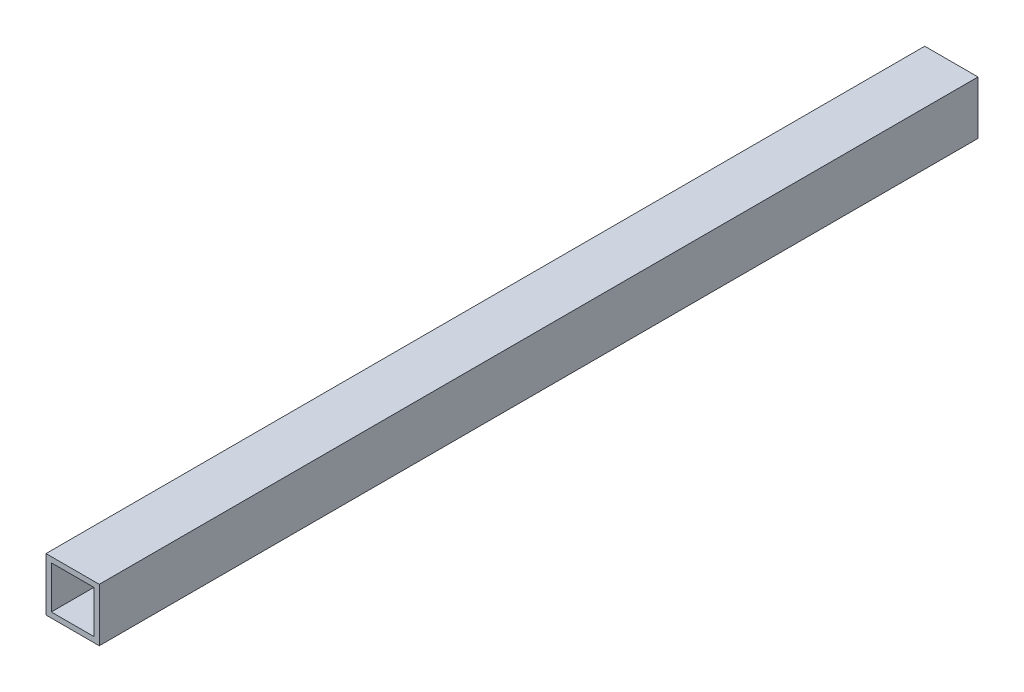
ISO-10303-21;
HEADER;
FILE_DESCRIPTION(('STEP AP214'),'2;1');
FILE_NAME('part.step','',(''),(''),'','','');
FILE_SCHEMA(('AUTOMOTIVE_DESIGN { 1 0 10303 214 1 1 1 1 }'));
ENDSEC;
DATA;
#1=APPLICATION_CONTEXT('core data for automotive mechanical design processes');
#2=APPLICATION_PROTOCOL_DEFINITION('international standard','automotive_design',2000,#1);
#3=PRODUCT_CONTEXT('',#1,'mechanical');
#4=PRODUCT('Part','Part','',(#3));
#5=PRODUCT_RELATED_PRODUCT_CATEGORY('part','',(#4));
#6=PRODUCT_DEFINITION_FORMATION('','',#4);
#7=PRODUCT_DEFINITION_CONTEXT('part definition',#1,'design');
#8=PRODUCT_DEFINITION('design','',#6,#7);
#9=PRODUCT_DEFINITION_SHAPE('','',#8);
#10=(LENGTH_UNIT() NAMED_UNIT(*) SI_UNIT(.MILLI.,.METRE.));
#11=(NAMED_UNIT(*) PLANE_ANGLE_UNIT() SI_UNIT($,.RADIAN.));
#12=(NAMED_UNIT(*) SI_UNIT($,.STERADIAN.) SOLID_ANGLE_UNIT());
#13=UNCERTAINTY_MEASURE_WITH_UNIT(LENGTH_MEASURE(1.E-05),#10,'distance_accuracy_value','');
#14=(GEOMETRIC_REPRESENTATION_CONTEXT(3) GLOBAL_UNCERTAINTY_ASSIGNED_CONTEXT((#13)) GLOBAL_UNIT_ASSIGNED_CONTEXT((#10,
#11,#12)) REPRESENTATION_CONTEXT('',''));
#15=CARTESIAN_POINT('',(0.,0.,0.));
#16=DIRECTION('',(0.,0.,1.));
#17=DIRECTION('',(1.,0.,0.));
#18=AXIS2_PLACEMENT_3D('',#15,#16,#17);
#19=CARTESIAN_POINT('',(0.,0.,209.55));
#20=DIRECTION('',(0.,0.,-1.));
#21=DIRECTION('',(-1.,0.,0.));
#22=AXIS2_PLACEMENT_3D('',#19,#20,#21);
#23=PLANE('',#22);
#24=DIRECTION('',(0.,1.,0.));
#25=VECTOR('',#24,1.);
#26=CARTESIAN_POINT('',(12.7,-12.7,209.55));
#27=LINE('',#26,#25);
#28=CARTESIAN_POINT('',(12.7,-12.7,209.55));
#29=VERTEX_POINT('',#28);
#30=CARTESIAN_POINT('',(12.7,12.7,209.55));
#31=VERTEX_POINT('',#30);
#32=EDGE_CURVE('E135',#29,#31,#27,.T.);
#33=ORIENTED_EDGE('',*,*,#32,.T.);
#34=DIRECTION('',(-1.,0.,0.));
#35=VECTOR('',#34,1.);
#36=CARTESIAN_POINT('',(-12.7,12.7,209.55));
#37=LINE('',#36,#35);
#38=CARTESIAN_POINT('',(-12.7,12.7,209.55));
#39=VERTEX_POINT('',#38);
#40=EDGE_CURVE('E138',#31,#39,#37,.T.);
#41=ORIENTED_EDGE('',*,*,#40,.T.);
#42=DIRECTION('',(0.,-1.,0.));
#43=VECTOR('',#42,1.);
#44=CARTESIAN_POINT('',(-12.7,-12.7,209.55));
#45=LINE('',#44,#43);
#46=CARTESIAN_POINT('',(-12.7,-12.7,209.55));
#47=VERTEX_POINT('',#46);
#48=EDGE_CURVE('E141',#39,#47,#45,.T.);
#49=ORIENTED_EDGE('',*,*,#48,.T.);
#50=DIRECTION('',(1.,0.,0.));
#51=VECTOR('',#50,1.);
#52=CARTESIAN_POINT('',(-12.7,-12.7,209.55));
#53=LINE('',#52,#51);
#54=EDGE_CURVE('E143',#47,#29,#53,.T.);
#55=ORIENTED_EDGE('',*,*,#54,.T.);
#56=EDGE_LOOP('',(#33,#41,#49,#55));
#57=FACE_BOUND('',#56,.T.);
#58=DIRECTION('',(0.,-1.,0.));
#59=VECTOR('',#58,1.);
#60=CARTESIAN_POINT('',(-10.16,-10.16,209.55));
#61=LINE('',#60,#59);
#62=CARTESIAN_POINT('',(-10.16,10.16,209.55));
#63=VERTEX_POINT('',#62);
#64=CARTESIAN_POINT('',(-10.16,-10.16,209.55));
#65=VERTEX_POINT('',#64);
#66=EDGE_CURVE('E99',#63,#65,#61,.T.);
#67=ORIENTED_EDGE('',*,*,#66,.F.);
#68=DIRECTION('',(-1.,0.,0.));
#69=VECTOR('',#68,1.);
#70=CARTESIAN_POINT('',(-10.16,10.16,209.55));
#71=LINE('',#70,#69);
#72=CARTESIAN_POINT('',(10.16,10.16,209.55));
#73=VERTEX_POINT('',#72);
#74=EDGE_CURVE('E121',#73,#63,#71,.T.);
#75=ORIENTED_EDGE('',*,*,#74,.F.);
#76=DIRECTION('',(0.,1.,0.));
#77=VECTOR('',#76,1.);
#78=CARTESIAN_POINT('',(10.16,-10.16,209.55));
#79=LINE('',#78,#77);
#80=CARTESIAN_POINT('',(10.16,-10.16,209.55));
#81=VERTEX_POINT('',#80);
#82=EDGE_CURVE('E119',#81,#73,#79,.T.);
#83=ORIENTED_EDGE('',*,*,#82,.F.);
#84=DIRECTION('',(1.,0.,0.));
#85=VECTOR('',#84,1.);
#86=CARTESIAN_POINT('',(-10.16,-10.16,209.55));
#87=LINE('',#86,#85);
#88=EDGE_CURVE('E107',#65,#81,#87,.T.);
#89=ORIENTED_EDGE('',*,*,#88,.F.);
#90=EDGE_LOOP('',(#67,#75,#83,#89));
#91=FACE_BOUND('',#90,.T.);
#92=ADVANCED_FACE('F34',(#57,#91),#23,.F.);
#93=CARTESIAN_POINT('',(0.,0.,-209.55));
#94=DIRECTION('',(0.,0.,-1.));
#95=DIRECTION('',(-1.,0.,0.));
#96=AXIS2_PLACEMENT_3D('',#93,#94,#95);
#97=PLANE('',#96);
#98=DIRECTION('',(0.,1.,0.));
#99=VECTOR('',#98,1.);
#100=CARTESIAN_POINT('',(12.7,-12.7,-209.55));
#101=LINE('',#100,#99);
#102=CARTESIAN_POINT('',(12.7,-12.7,-209.55));
#103=VERTEX_POINT('',#102);
#104=CARTESIAN_POINT('',(12.7,12.7,-209.55));
#105=VERTEX_POINT('',#104);
#106=EDGE_CURVE('E115',#103,#105,#101,.T.);
#107=ORIENTED_EDGE('',*,*,#106,.F.);
#108=DIRECTION('',(1.,0.,0.));
#109=VECTOR('',#108,1.);
#110=CARTESIAN_POINT('',(-12.7,-12.7,-209.55));
#111=LINE('',#110,#109);
#112=CARTESIAN_POINT('',(-12.7,-12.7,-209.55));
#113=VERTEX_POINT('',#112);
#114=EDGE_CURVE('E139',#113,#103,#111,.T.);
#115=ORIENTED_EDGE('',*,*,#114,.F.);
#116=DIRECTION('',(0.,-1.,0.));
#117=VECTOR('',#116,1.);
#118=CARTESIAN_POINT('',(-12.7,-12.7,-209.55));
#119=LINE('',#118,#117);
#120=CARTESIAN_POINT('',(-12.7,12.7,-209.55));
#121=VERTEX_POINT('',#120);
#122=EDGE_CURVE('E150',#121,#113,#119,.T.);
#123=ORIENTED_EDGE('',*,*,#122,.F.);
#124=DIRECTION('',(-1.,0.,0.));
#125=VECTOR('',#124,1.);
#126=CARTESIAN_POINT('',(-12.7,12.7,-209.55));
#127=LINE('',#126,#125);
#128=EDGE_CURVE('E148',#105,#121,#127,.T.);
#129=ORIENTED_EDGE('',*,*,#128,.F.);
#130=EDGE_LOOP('',(#107,#115,#123,#129));
#131=FACE_BOUND('',#130,.T.);
#132=DIRECTION('',(-1.,0.,0.));
#133=VECTOR('',#132,1.);
#134=CARTESIAN_POINT('',(-10.16,10.16,-209.55));
#135=LINE('',#134,#133);
#136=CARTESIAN_POINT('',(10.16,10.16,-209.55));
#137=VERTEX_POINT('',#136);
#138=CARTESIAN_POINT('',(-10.16,10.16,-209.55));
#139=VERTEX_POINT('',#138);
#140=EDGE_CURVE('E108',#137,#139,#135,.T.);
#141=ORIENTED_EDGE('',*,*,#140,.T.);
#142=DIRECTION('',(0.,-1.,0.));
#143=VECTOR('',#142,1.);
#144=CARTESIAN_POINT('',(-10.16,-10.16,-209.55));
#145=LINE('',#144,#143);
#146=CARTESIAN_POINT('',(-10.16,-10.16,-209.55));
#147=VERTEX_POINT('',#146);
#148=EDGE_CURVE('E57',#139,#147,#145,.T.);
#149=ORIENTED_EDGE('',*,*,#148,.T.);
#150=DIRECTION('',(1.,0.,0.));
#151=VECTOR('',#150,1.);
#152=CARTESIAN_POINT('',(-10.16,-10.16,-209.55));
#153=LINE('',#152,#151);
#154=CARTESIAN_POINT('',(10.16,-10.16,-209.55));
#155=VERTEX_POINT('',#154);
#156=EDGE_CURVE('E114',#147,#155,#153,.T.);
#157=ORIENTED_EDGE('',*,*,#156,.T.);
#158=DIRECTION('',(0.,1.,0.));
#159=VECTOR('',#158,1.);
#160=CARTESIAN_POINT('',(10.16,-10.16,-209.55));
#161=LINE('',#160,#159);
#162=EDGE_CURVE('E127',#155,#137,#161,.T.);
#163=ORIENTED_EDGE('',*,*,#162,.T.);
#164=EDGE_LOOP('',(#141,#149,#157,#163));
#165=FACE_BOUND('',#164,.T.);
#166=ADVANCED_FACE('F168',(#131,#165),#97,.T.);
#167=CARTESIAN_POINT('',(12.7,-12.7,209.55));
#168=DIRECTION('',(-1.,0.,0.));
#169=DIRECTION('',(0.,-1.,0.));
#170=AXIS2_PLACEMENT_3D('',#167,#168,#169);
#171=PLANE('',#170);
#172=ORIENTED_EDGE('',*,*,#106,.T.);
#173=DIRECTION('',(0.,0.,-1.));
#174=VECTOR('',#173,1.);
#175=CARTESIAN_POINT('',(12.7,12.7,209.55));
#176=LINE('',#175,#174);
#177=EDGE_CURVE('E11',#31,#105,#176,.T.);
#178=ORIENTED_EDGE('',*,*,#177,.F.);
#179=ORIENTED_EDGE('',*,*,#32,.F.);
#180=DIRECTION('',(0.,0.,-1.));
#181=VECTOR('',#180,1.);
#182=CARTESIAN_POINT('',(12.7,-12.7,209.55));
#183=LINE('',#182,#181);
#184=EDGE_CURVE('E145',#29,#103,#183,.T.);
#185=ORIENTED_EDGE('',*,*,#184,.T.);
#186=EDGE_LOOP('',(#172,#178,#179,#185));
#187=FACE_BOUND('',#186,.T.);
#188=ADVANCED_FACE('F36',(#187),#171,.F.);
#189=CARTESIAN_POINT('',(-12.7,12.7,209.55));
#190=DIRECTION('',(0.,-1.,0.));
#191=DIRECTION('',(0.,0.,-1.));
#192=AXIS2_PLACEMENT_3D('',#189,#190,#191);
#193=PLANE('',#192);
#194=ORIENTED_EDGE('',*,*,#128,.T.);
#195=DIRECTION('',(0.,0.,-1.));
#196=VECTOR('',#195,1.);
#197=CARTESIAN_POINT('',(-12.7,12.7,209.55));
#198=LINE('',#197,#196);
#199=EDGE_CURVE('E42',#39,#121,#198,.T.);
#200=ORIENTED_EDGE('',*,*,#199,.F.);
#201=ORIENTED_EDGE('',*,*,#40,.F.);
#202=ORIENTED_EDGE('',*,*,#177,.T.);
#203=EDGE_LOOP('',(#194,#200,#201,#202));
#204=FACE_BOUND('',#203,.T.);
#205=ADVANCED_FACE('F178',(#204),#193,.F.);
#206=CARTESIAN_POINT('',(-12.7,-12.7,209.55));
#207=DIRECTION('',(1.,0.,0.));
#208=DIRECTION('',(0.,1.,0.));
#209=AXIS2_PLACEMENT_3D('',#206,#207,#208);
#210=PLANE('',#209);
#211=ORIENTED_EDGE('',*,*,#122,.T.);
#212=DIRECTION('',(0.,0.,-1.));
#213=VECTOR('',#212,1.);
#214=CARTESIAN_POINT('',(-12.7,-12.7,209.55));
#215=LINE('',#214,#213);
#216=EDGE_CURVE('E155',#47,#113,#215,.T.);
#217=ORIENTED_EDGE('',*,*,#216,.F.);
#218=ORIENTED_EDGE('',*,*,#48,.F.);
#219=ORIENTED_EDGE('',*,*,#199,.T.);
#220=EDGE_LOOP('',(#211,#217,#218,#219));
#221=FACE_BOUND('',#220,.T.);
#222=ADVANCED_FACE('F162',(#221),#210,.F.);
#223=CARTESIAN_POINT('',(-12.7,-12.7,209.55));
#224=DIRECTION('',(0.,1.,0.));
#225=DIRECTION('',(-1.,0.,0.));
#226=AXIS2_PLACEMENT_3D('',#223,#224,#225);
#227=PLANE('',#226);
#228=ORIENTED_EDGE('',*,*,#114,.T.);
#229=ORIENTED_EDGE('',*,*,#184,.F.);
#230=ORIENTED_EDGE('',*,*,#54,.F.);
#231=ORIENTED_EDGE('',*,*,#216,.T.);
#232=EDGE_LOOP('',(#228,#229,#230,#231));
#233=FACE_BOUND('',#232,.T.);
#234=ADVANCED_FACE('F172',(#233),#227,.F.);
#235=CARTESIAN_POINT('',(-10.16,-10.16,209.55));
#236=DIRECTION('',(1.,0.,0.));
#237=DIRECTION('',(0.,0.,-1.));
#238=AXIS2_PLACEMENT_3D('',#235,#236,#237);
#239=PLANE('',#238);
#240=ORIENTED_EDGE('',*,*,#148,.F.);
#241=DIRECTION('',(0.,0.,-1.));
#242=VECTOR('',#241,1.);
#243=CARTESIAN_POINT('',(-10.16,10.16,209.55));
#244=LINE('',#243,#242);
#245=EDGE_CURVE('E103',#63,#139,#244,.T.);
#246=ORIENTED_EDGE('',*,*,#245,.F.);
#247=ORIENTED_EDGE('',*,*,#66,.T.);
#248=DIRECTION('',(0.,0.,-1.));
#249=VECTOR('',#248,1.);
#250=CARTESIAN_POINT('',(-10.16,-10.16,209.55));
#251=LINE('',#250,#249);
#252=EDGE_CURVE('E102',#65,#147,#251,.T.);
#253=ORIENTED_EDGE('',*,*,#252,.T.);
#254=EDGE_LOOP('',(#240,#246,#247,#253));
#255=FACE_BOUND('',#254,.T.);
#256=ADVANCED_FACE('F101',(#255),#239,.T.);
#257=CARTESIAN_POINT('',(-10.16,-10.16,209.55));
#258=DIRECTION('',(0.,1.,0.));
#259=DIRECTION('',(0.,0.,1.));
#260=AXIS2_PLACEMENT_3D('',#257,#258,#259);
#261=PLANE('',#260);
#262=ORIENTED_EDGE('',*,*,#156,.F.);
#263=ORIENTED_EDGE('',*,*,#252,.F.);
#264=ORIENTED_EDGE('',*,*,#88,.T.);
#265=DIRECTION('',(0.,0.,-1.));
#266=VECTOR('',#265,1.);
#267=CARTESIAN_POINT('',(10.16,-10.16,209.55));
#268=LINE('',#267,#266);
#269=EDGE_CURVE('E116',#81,#155,#268,.T.);
#270=ORIENTED_EDGE('',*,*,#269,.T.);
#271=EDGE_LOOP('',(#262,#263,#264,#270));
#272=FACE_BOUND('',#271,.T.);
#273=ADVANCED_FACE('F111',(#272),#261,.T.);
#274=CARTESIAN_POINT('',(10.16,-10.16,209.55));
#275=DIRECTION('',(-1.,0.,0.));
#276=DIRECTION('',(0.,0.,1.));
#277=AXIS2_PLACEMENT_3D('',#274,#275,#276);
#278=PLANE('',#277);
#279=ORIENTED_EDGE('',*,*,#162,.F.);
#280=ORIENTED_EDGE('',*,*,#269,.F.);
#281=ORIENTED_EDGE('',*,*,#82,.T.);
#282=DIRECTION('',(0.,0.,-1.));
#283=VECTOR('',#282,1.);
#284=CARTESIAN_POINT('',(10.16,10.16,209.55));
#285=LINE('',#284,#283);
#286=EDGE_CURVE('E49',#73,#137,#285,.T.);
#287=ORIENTED_EDGE('',*,*,#286,.T.);
#288=EDGE_LOOP('',(#279,#280,#281,#287));
#289=FACE_BOUND('',#288,.T.);
#290=ADVANCED_FACE('F201',(#289),#278,.T.);
#291=CARTESIAN_POINT('',(-10.16,10.16,209.55));
#292=DIRECTION('',(0.,-1.,0.));
#293=DIRECTION('',(0.,0.,-1.));
#294=AXIS2_PLACEMENT_3D('',#291,#292,#293);
#295=PLANE('',#294);
#296=ORIENTED_EDGE('',*,*,#140,.F.);
#297=ORIENTED_EDGE('',*,*,#286,.F.);
#298=ORIENTED_EDGE('',*,*,#74,.T.);
#299=ORIENTED_EDGE('',*,*,#245,.T.);
#300=EDGE_LOOP('',(#296,#297,#298,#299));
#301=FACE_BOUND('',#300,.T.);
#302=ADVANCED_FACE('F205',(#301),#295,.T.);
#303=CLOSED_SHELL('',(#92,#166,#188,#205,#222,#234,#256,#273,#290,#302));
#304=MANIFOLD_SOLID_BREP('B2',#303);
#305=ADVANCED_BREP_SHAPE_REPRESENTATION('',(#18,#304),#14);
#306=SHAPE_DEFINITION_REPRESENTATION(#9,#305);
ENDSEC;
END-ISO-10303-21;
